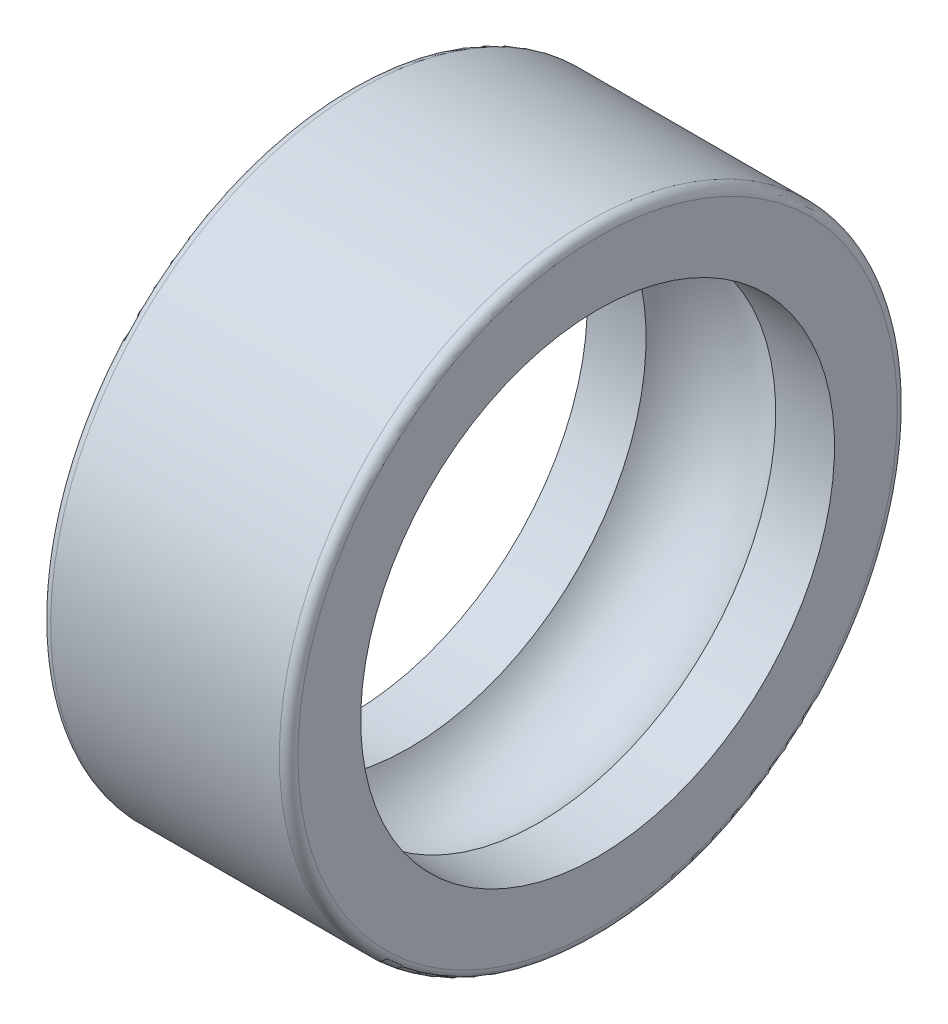
ISO-10303-21;
HEADER;
FILE_DESCRIPTION(('STEP AP214'),'2;1');
FILE_NAME('part.step','',(''),(''),'','','');
FILE_SCHEMA(('AUTOMOTIVE_DESIGN { 1 0 10303 214 1 1 1 1 }'));
ENDSEC;
DATA;
#1=APPLICATION_CONTEXT('core data for automotive mechanical design processes');
#2=APPLICATION_PROTOCOL_DEFINITION('international standard','automotive_design',2000,#1);
#3=PRODUCT_CONTEXT('',#1,'mechanical');
#4=PRODUCT('Part','Part','',(#3));
#5=PRODUCT_RELATED_PRODUCT_CATEGORY('part','',(#4));
#6=PRODUCT_DEFINITION_FORMATION('','',#4);
#7=PRODUCT_DEFINITION_CONTEXT('part definition',#1,'design');
#8=PRODUCT_DEFINITION('design','',#6,#7);
#9=PRODUCT_DEFINITION_SHAPE('','',#8);
#10=(LENGTH_UNIT() NAMED_UNIT(*) SI_UNIT(.MILLI.,.METRE.));
#11=(NAMED_UNIT(*) PLANE_ANGLE_UNIT() SI_UNIT($,.RADIAN.));
#12=(NAMED_UNIT(*) SI_UNIT($,.STERADIAN.) SOLID_ANGLE_UNIT());
#13=UNCERTAINTY_MEASURE_WITH_UNIT(LENGTH_MEASURE(1.E-05),#10,'distance_accuracy_value','');
#14=(GEOMETRIC_REPRESENTATION_CONTEXT(3) GLOBAL_UNCERTAINTY_ASSIGNED_CONTEXT((#13)) GLOBAL_UNIT_ASSIGNED_CONTEXT((#10,
#11,#12)) REPRESENTATION_CONTEXT('',''));
#15=CARTESIAN_POINT('',(0.,0.,0.));
#16=DIRECTION('',(0.,0.,1.));
#17=DIRECTION('',(1.,0.,0.));
#18=AXIS2_PLACEMENT_3D('',#15,#16,#17);
#19=CARTESIAN_POINT('',(0.,0.,0.));
#20=DIRECTION('',(1.,0.,0.));
#21=DIRECTION('',(0.,0.,-1.));
#22=AXIS2_PLACEMENT_3D('',#19,#20,#21);
#23=TOROIDAL_SURFACE('',#22,3.25,1.2);
#24=CARTESIAN_POINT('',(1.04867641444929,0.,0.));
#25=DIRECTION('',(1.,0.,0.));
#26=DIRECTION('',(0.,1.,0.));
#27=AXIS2_PLACEMENT_3D('',#24,#25,#26);
#28=CIRCLE('',#27,3.83333333333333);
#29=CARTESIAN_POINT('',(1.04867641444929,3.83333333333333,0.));
#30=VERTEX_POINT('',#29);
#31=EDGE_CURVE('E11',#30,#30,#28,.T.);
#32=ORIENTED_EDGE('',*,*,#31,.T.);
#33=EDGE_LOOP('',(#32));
#34=FACE_BOUND('',#33,.T.);
#35=CARTESIAN_POINT('',(-1.04867641444929,0.,0.));
#36=DIRECTION('',(1.,0.,0.));
#37=DIRECTION('',(0.,1.,0.));
#38=AXIS2_PLACEMENT_3D('',#35,#36,#37);
#39=CIRCLE('',#38,3.83333333333333);
#40=CARTESIAN_POINT('',(-1.04867641444929,3.83333333333333,0.));
#41=VERTEX_POINT('',#40);
#42=EDGE_CURVE('E46',#41,#41,#39,.T.);
#43=ORIENTED_EDGE('',*,*,#42,.F.);
#44=EDGE_LOOP('',(#43));
#45=FACE_BOUND('',#44,.T.);
#46=ADVANCED_FACE('F16',(#34,#45),#23,.F.);
#47=CARTESIAN_POINT('',(1.52433820722464,0.,0.));
#48=DIRECTION('',(-1.,0.,0.));
#49=DIRECTION('',(0.,1.,0.));
#50=AXIS2_PLACEMENT_3D('',#47,#48,#49);
#51=CYLINDRICAL_SURFACE('',#50,3.83333333333333);
#52=CARTESIAN_POINT('',(2.,0.,0.));
#53=DIRECTION('',(1.,0.,0.));
#54=DIRECTION('',(0.,1.,0.));
#55=AXIS2_PLACEMENT_3D('',#52,#53,#54);
#56=CIRCLE('',#55,3.83333333333333);
#57=CARTESIAN_POINT('',(2.,3.83333333333333,0.));
#58=VERTEX_POINT('',#57);
#59=EDGE_CURVE('E25',#58,#58,#56,.T.);
#60=ORIENTED_EDGE('',*,*,#59,.T.);
#61=EDGE_LOOP('',(#60));
#62=FACE_BOUND('',#61,.T.);
#63=ORIENTED_EDGE('',*,*,#31,.F.);
#64=EDGE_LOOP('',(#63));
#65=FACE_BOUND('',#64,.T.);
#66=ADVANCED_FACE('F70',(#62,#65),#51,.F.);
#67=CARTESIAN_POINT('',(2.,4.34166666666667,0.));
#68=DIRECTION('',(1.,0.,0.));
#69=DIRECTION('',(0.,1.,0.));
#70=AXIS2_PLACEMENT_3D('',#67,#68,#69);
#71=PLANE('',#70);
#72=CARTESIAN_POINT('',(2.,0.,0.));
#73=DIRECTION('',(1.,0.,0.));
#74=DIRECTION('',(0.,1.,0.));
#75=AXIS2_PLACEMENT_3D('',#72,#73,#74);
#76=CIRCLE('',#75,4.85);
#77=CARTESIAN_POINT('',(2.,4.85,0.));
#78=VERTEX_POINT('',#77);
#79=EDGE_CURVE('E65',#78,#78,#76,.T.);
#80=ORIENTED_EDGE('',*,*,#79,.T.);
#81=EDGE_LOOP('',(#80));
#82=FACE_BOUND('',#81,.T.);
#83=ORIENTED_EDGE('',*,*,#59,.F.);
#84=EDGE_LOOP('',(#83));
#85=FACE_BOUND('',#84,.T.);
#86=ADVANCED_FACE('F73',(#82,#85),#71,.T.);
#87=CARTESIAN_POINT('',(1.85,0.,0.));
#88=DIRECTION('',(1.,0.,0.));
#89=DIRECTION('',(0.,0.,-1.));
#90=AXIS2_PLACEMENT_3D('',#87,#88,#89);
#91=TOROIDAL_SURFACE('',#90,4.85,0.15);
#92=CARTESIAN_POINT('',(1.85,0.,0.));
#93=DIRECTION('',(1.,0.,0.));
#94=DIRECTION('',(0.,1.,0.));
#95=AXIS2_PLACEMENT_3D('',#92,#93,#94);
#96=CIRCLE('',#95,5.);
#97=CARTESIAN_POINT('',(1.85,5.,0.));
#98=VERTEX_POINT('',#97);
#99=EDGE_CURVE('E62',#98,#98,#96,.T.);
#100=ORIENTED_EDGE('',*,*,#99,.T.);
#101=EDGE_LOOP('',(#100));
#102=FACE_BOUND('',#101,.T.);
#103=ORIENTED_EDGE('',*,*,#79,.F.);
#104=EDGE_LOOP('',(#103));
#105=FACE_BOUND('',#104,.T.);
#106=ADVANCED_FACE('F18',(#102,#105),#91,.T.);
#107=CARTESIAN_POINT('',(0.,0.,0.));
#108=DIRECTION('',(-1.,0.,0.));
#109=DIRECTION('',(0.,1.,0.));
#110=AXIS2_PLACEMENT_3D('',#107,#108,#109);
#111=CYLINDRICAL_SURFACE('',#110,5.);
#112=CARTESIAN_POINT('',(-1.85,0.,0.));
#113=DIRECTION('',(1.,0.,0.));
#114=DIRECTION('',(0.,1.,0.));
#115=AXIS2_PLACEMENT_3D('',#112,#113,#114);
#116=CIRCLE('',#115,5.);
#117=CARTESIAN_POINT('',(-1.85,5.,0.));
#118=VERTEX_POINT('',#117);
#119=EDGE_CURVE('E61',#118,#118,#116,.T.);
#120=ORIENTED_EDGE('',*,*,#119,.T.);
#121=EDGE_LOOP('',(#120));
#122=FACE_BOUND('',#121,.T.);
#123=ORIENTED_EDGE('',*,*,#99,.F.);
#124=EDGE_LOOP('',(#123));
#125=FACE_BOUND('',#124,.T.);
#126=ADVANCED_FACE('F80',(#122,#125),#111,.T.);
#127=CARTESIAN_POINT('',(-1.85,0.,0.));
#128=DIRECTION('',(1.,0.,0.));
#129=DIRECTION('',(0.,0.,-1.));
#130=AXIS2_PLACEMENT_3D('',#127,#128,#129);
#131=TOROIDAL_SURFACE('',#130,4.85,0.15);
#132=CARTESIAN_POINT('',(-2.,0.,0.));
#133=DIRECTION('',(1.,0.,0.));
#134=DIRECTION('',(0.,1.,0.));
#135=AXIS2_PLACEMENT_3D('',#132,#133,#134);
#136=CIRCLE('',#135,4.85);
#137=CARTESIAN_POINT('',(-2.,4.85,0.));
#138=VERTEX_POINT('',#137);
#139=EDGE_CURVE('E56',#138,#138,#136,.T.);
#140=ORIENTED_EDGE('',*,*,#139,.T.);
#141=EDGE_LOOP('',(#140));
#142=FACE_BOUND('',#141,.T.);
#143=ORIENTED_EDGE('',*,*,#119,.F.);
#144=EDGE_LOOP('',(#143));
#145=FACE_BOUND('',#144,.T.);
#146=ADVANCED_FACE('F92',(#142,#145),#131,.T.);
#147=CARTESIAN_POINT('',(-2.,4.34166666666667,0.));
#148=DIRECTION('',(-1.,0.,0.));
#149=DIRECTION('',(0.,-1.,0.));
#150=AXIS2_PLACEMENT_3D('',#147,#148,#149);
#151=PLANE('',#150);
#152=CARTESIAN_POINT('',(-2.,0.,0.));
#153=DIRECTION('',(1.,0.,0.));
#154=DIRECTION('',(0.,1.,0.));
#155=AXIS2_PLACEMENT_3D('',#152,#153,#154);
#156=CIRCLE('',#155,3.83333333333333);
#157=CARTESIAN_POINT('',(-2.,3.83333333333333,0.));
#158=VERTEX_POINT('',#157);
#159=EDGE_CURVE('E51',#158,#158,#156,.T.);
#160=ORIENTED_EDGE('',*,*,#159,.T.);
#161=EDGE_LOOP('',(#160));
#162=FACE_BOUND('',#161,.T.);
#163=ORIENTED_EDGE('',*,*,#139,.F.);
#164=EDGE_LOOP('',(#163));
#165=FACE_BOUND('',#164,.T.);
#166=ADVANCED_FACE('F52',(#162,#165),#151,.T.);
#167=CARTESIAN_POINT('',(-1.52433820722464,0.,0.));
#168=DIRECTION('',(-1.,0.,0.));
#169=DIRECTION('',(0.,1.,0.));
#170=AXIS2_PLACEMENT_3D('',#167,#168,#169);
#171=CYLINDRICAL_SURFACE('',#170,3.83333333333333);
#172=ORIENTED_EDGE('',*,*,#42,.T.);
#173=EDGE_LOOP('',(#172));
#174=FACE_BOUND('',#173,.T.);
#175=ORIENTED_EDGE('',*,*,#159,.F.);
#176=EDGE_LOOP('',(#175));
#177=FACE_BOUND('',#176,.T.);
#178=ADVANCED_FACE('F106',(#174,#177),#171,.F.);
#179=CLOSED_SHELL('',(#46,#66,#86,#106,#126,#146,#166,#178));
#180=MANIFOLD_SOLID_BREP('B1',#179);
#181=ADVANCED_BREP_SHAPE_REPRESENTATION('',(#18,#180),#14);
#182=SHAPE_DEFINITION_REPRESENTATION(#9,#181);
ENDSEC;
END-ISO-10303-21;
